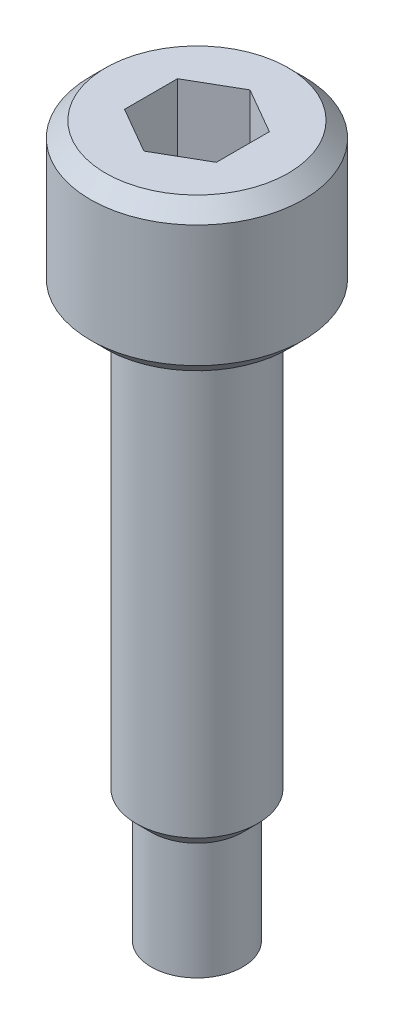
ISO-10303-21;
HEADER;
FILE_DESCRIPTION(('STEP AP214'),'2;1');
FILE_NAME('part.step','',(''),(''),'','','');
FILE_SCHEMA(('AUTOMOTIVE_DESIGN { 1 0 10303 214 1 1 1 1 }'));
ENDSEC;
DATA;
#1=APPLICATION_CONTEXT('core data for automotive mechanical design processes');
#2=APPLICATION_PROTOCOL_DEFINITION('international standard','automotive_design',2000,#1);
#3=PRODUCT_CONTEXT('',#1,'mechanical');
#4=PRODUCT('Part','Part','',(#3));
#5=PRODUCT_RELATED_PRODUCT_CATEGORY('part','',(#4));
#6=PRODUCT_DEFINITION_FORMATION('','',#4);
#7=PRODUCT_DEFINITION_CONTEXT('part definition',#1,'design');
#8=PRODUCT_DEFINITION('design','',#6,#7);
#9=PRODUCT_DEFINITION_SHAPE('','',#8);
#10=(LENGTH_UNIT() NAMED_UNIT(*) SI_UNIT(.MILLI.,.METRE.));
#11=(NAMED_UNIT(*) PLANE_ANGLE_UNIT() SI_UNIT($,.RADIAN.));
#12=(NAMED_UNIT(*) SI_UNIT($,.STERADIAN.) SOLID_ANGLE_UNIT());
#13=UNCERTAINTY_MEASURE_WITH_UNIT(LENGTH_MEASURE(1.E-05),#10,'distance_accuracy_value','');
#14=(GEOMETRIC_REPRESENTATION_CONTEXT(3) GLOBAL_UNCERTAINTY_ASSIGNED_CONTEXT((#13)) GLOBAL_UNIT_ASSIGNED_CONTEXT((#10,
#11,#12)) REPRESENTATION_CONTEXT('',''));
#15=CARTESIAN_POINT('',(0.,0.,0.));
#16=DIRECTION('',(0.,0.,1.));
#17=DIRECTION('',(1.,0.,0.));
#18=AXIS2_PLACEMENT_3D('',#15,#16,#17);
#19=CARTESIAN_POINT('',(0.,0.,0.));
#20=DIRECTION('',(0.,1.,0.));
#21=DIRECTION('',(-1.,0.,0.));
#22=AXIS2_PLACEMENT_3D('',#19,#20,#21);
#23=PLANE('',#22);
#24=CARTESIAN_POINT('',(0.,0.,0.));
#25=DIRECTION('',(0.,1.,0.));
#26=DIRECTION('',(-1.,0.,0.));
#27=AXIS2_PLACEMENT_3D('',#24,#25,#26);
#28=CIRCLE('',#27,4.50000000000001);
#29=CARTESIAN_POINT('',(-4.50000000000001,0.,0.));
#30=VERTEX_POINT('',#29);
#31=EDGE_CURVE('E160',#30,#30,#28,.T.);
#32=ORIENTED_EDGE('',*,*,#31,.F.);
#33=EDGE_LOOP('',(#32));
#34=FACE_BOUND('',#33,.T.);
#35=ADVANCED_FACE('F43',(#34),#23,.F.);
#36=CARTESIAN_POINT('',(0.,70.,0.));
#37=DIRECTION('',(0.,1.,0.));
#38=DIRECTION('',(-1.,0.,0.));
#39=AXIS2_PLACEMENT_3D('',#36,#37,#38);
#40=CYLINDRICAL_SURFACE('',#39,4.50000000000001);
#41=CARTESIAN_POINT('',(0.,11.5,0.));
#42=DIRECTION('',(0.,1.,0.));
#43=DIRECTION('',(-1.,0.,0.));
#44=AXIS2_PLACEMENT_3D('',#41,#42,#43);
#45=CIRCLE('',#44,4.50000000000001);
#46=CARTESIAN_POINT('',(-4.50000000000001,11.5,0.));
#47=VERTEX_POINT('',#46);
#48=EDGE_CURVE('E152',#47,#47,#45,.T.);
#49=ORIENTED_EDGE('',*,*,#48,.F.);
#50=EDGE_LOOP('',(#49));
#51=FACE_BOUND('',#50,.T.);
#52=ORIENTED_EDGE('',*,*,#31,.T.);
#53=EDGE_LOOP('',(#52));
#54=FACE_BOUND('',#53,.T.);
#55=ADVANCED_FACE('F204',(#51,#54),#40,.T.);
#56=CARTESIAN_POINT('',(0.,70.,0.));
#57=DIRECTION('',(0.,1.,0.));
#58=DIRECTION('',(-1.,0.,0.));
#59=AXIS2_PLACEMENT_3D('',#56,#57,#58);
#60=CYLINDRICAL_SURFACE('',#59,6.00000000000001);
#61=CARTESIAN_POINT('',(0.,13.,0.));
#62=DIRECTION('',(0.,1.,0.));
#63=DIRECTION('',(-1.,0.,0.));
#64=AXIS2_PLACEMENT_3D('',#61,#62,#63);
#65=CIRCLE('',#64,6.00000000000001);
#66=CARTESIAN_POINT('',(-6.00000000000001,13.,0.));
#67=VERTEX_POINT('',#66);
#68=EDGE_CURVE('E159',#67,#67,#65,.T.);
#69=ORIENTED_EDGE('',*,*,#68,.T.);
#70=EDGE_LOOP('',(#69));
#71=FACE_BOUND('',#70,.T.);
#72=CARTESIAN_POINT('',(0.,55.,0.));
#73=DIRECTION('',(0.,1.,0.));
#74=DIRECTION('',(-1.,0.,0.));
#75=AXIS2_PLACEMENT_3D('',#72,#73,#74);
#76=CIRCLE('',#75,6.00000000000001);
#77=CARTESIAN_POINT('',(-6.00000000000001,55.,0.));
#78=VERTEX_POINT('',#77);
#79=EDGE_CURVE('E148',#78,#78,#76,.T.);
#80=ORIENTED_EDGE('',*,*,#79,.F.);
#81=EDGE_LOOP('',(#80));
#82=FACE_BOUND('',#81,.T.);
#83=ADVANCED_FACE('F209',(#71,#82),#60,.T.);
#84=CARTESIAN_POINT('',(6.00000000000001,55.,0.));
#85=DIRECTION('',(0.,1.,0.));
#86=DIRECTION('',(-1.,0.,0.));
#87=AXIS2_PLACEMENT_3D('',#84,#85,#86);
#88=PLANE('',#87);
#89=CARTESIAN_POINT('',(0.,55.,0.));
#90=DIRECTION('',(0.,1.,0.));
#91=DIRECTION('',(-1.,0.,0.));
#92=AXIS2_PLACEMENT_3D('',#89,#90,#91);
#93=CIRCLE('',#92,9.00000000000001);
#94=CARTESIAN_POINT('',(-9.00000000000001,55.,0.));
#95=VERTEX_POINT('',#94);
#96=EDGE_CURVE('E55',#95,#95,#93,.F.);
#97=ORIENTED_EDGE('',*,*,#96,.T.);
#98=EDGE_LOOP('',(#97));
#99=FACE_BOUND('',#98,.T.);
#100=ORIENTED_EDGE('',*,*,#79,.T.);
#101=EDGE_LOOP('',(#100));
#102=FACE_BOUND('',#101,.T.);
#103=ADVANCED_FACE('F172',(#99,#102),#88,.F.);
#104=CARTESIAN_POINT('',(0.,70.,0.));
#105=DIRECTION('',(0.,1.,0.));
#106=DIRECTION('',(-1.,0.,0.));
#107=AXIS2_PLACEMENT_3D('',#104,#105,#106);
#108=CYLINDRICAL_SURFACE('',#107,10.5);
#109=CARTESIAN_POINT('',(0.,56.5,0.));
#110=DIRECTION('',(0.,1.,0.));
#111=DIRECTION('',(-1.,0.,0.));
#112=AXIS2_PLACEMENT_3D('',#109,#110,#111);
#113=CIRCLE('',#112,10.5);
#114=CARTESIAN_POINT('',(-10.5,56.5,0.));
#115=VERTEX_POINT('',#114);
#116=EDGE_CURVE('E167',#115,#115,#113,.T.);
#117=ORIENTED_EDGE('',*,*,#116,.T.);
#118=EDGE_LOOP('',(#117));
#119=FACE_BOUND('',#118,.T.);
#120=CARTESIAN_POINT('',(0.,68.5,0.));
#121=DIRECTION('',(0.,-1.,0.));
#122=DIRECTION('',(1.,0.,0.));
#123=AXIS2_PLACEMENT_3D('',#120,#121,#122);
#124=CIRCLE('',#123,10.5);
#125=CARTESIAN_POINT('',(10.5,68.5,0.));
#126=VERTEX_POINT('',#125);
#127=EDGE_CURVE('E162',#126,#126,#124,.T.);
#128=ORIENTED_EDGE('',*,*,#127,.T.);
#129=EDGE_LOOP('',(#128));
#130=FACE_BOUND('',#129,.T.);
#131=ADVANCED_FACE('F179',(#119,#130),#108,.T.);
#132=CARTESIAN_POINT('',(10.5,70.,0.));
#133=DIRECTION('',(0.,-1.,0.));
#134=DIRECTION('',(1.,0.,0.));
#135=AXIS2_PLACEMENT_3D('',#132,#133,#134);
#136=PLANE('',#135);
#137=DIRECTION('',(-0.866025403784438,0.,0.500000000000001));
#138=VECTOR('',#137,1.);
#139=CARTESIAN_POINT('',(0.,70.,-5.22463140982038));
#140=LINE('',#139,#138);
#141=CARTESIAN_POINT('',(0.,70.,-5.22463140982038));
#142=VERTEX_POINT('',#141);
#143=CARTESIAN_POINT('',(-4.52466352631456,70.,-2.61231570491018));
#144=VERTEX_POINT('',#143);
#145=EDGE_CURVE('E134',#142,#144,#140,.T.);
#146=ORIENTED_EDGE('',*,*,#145,.F.);
#147=DIRECTION('',(-0.866025403784442,0.,-0.499999999999995));
#148=VECTOR('',#147,1.);
#149=CARTESIAN_POINT('',(4.52466352631452,70.,-2.61231570491024));
#150=LINE('',#149,#148);
#151=CARTESIAN_POINT('',(4.52466352631452,70.,-2.61231570491024));
#152=VERTEX_POINT('',#151);
#153=EDGE_CURVE('E56',#152,#142,#150,.T.);
#154=ORIENTED_EDGE('',*,*,#153,.F.);
#155=DIRECTION('',(0.,0.,-1.));
#156=VECTOR('',#155,1.);
#157=CARTESIAN_POINT('',(4.52466352631457,70.,2.61231570491015));
#158=LINE('',#157,#156);
#159=CARTESIAN_POINT('',(4.52466352631457,70.,2.61231570491015));
#160=VERTEX_POINT('',#159);
#161=EDGE_CURVE('E142',#160,#152,#158,.T.);
#162=ORIENTED_EDGE('',*,*,#161,.F.);
#163=DIRECTION('',(0.866025403784435,0.,-0.500000000000007));
#164=VECTOR('',#163,1.);
#165=CARTESIAN_POINT('',(0.,70.,5.22463140982038));
#166=LINE('',#165,#164);
#167=CARTESIAN_POINT('',(0.,70.,5.22463140982038));
#168=VERTEX_POINT('',#167);
#169=EDGE_CURVE('E139',#168,#160,#166,.T.);
#170=ORIENTED_EDGE('',*,*,#169,.F.);
#171=DIRECTION('',(0.866025403784441,0.,0.499999999999995));
#172=VECTOR('',#171,1.);
#173=CARTESIAN_POINT('',(-4.52466352631455,70.,2.61231570491021));
#174=LINE('',#173,#172);
#175=CARTESIAN_POINT('',(-4.52466352631455,70.,2.61231570491021));
#176=VERTEX_POINT('',#175);
#177=EDGE_CURVE('E110',#176,#168,#174,.T.);
#178=ORIENTED_EDGE('',*,*,#177,.F.);
#179=DIRECTION('',(0.,0.,1.));
#180=VECTOR('',#179,1.);
#181=CARTESIAN_POINT('',(-4.52466352631456,70.,-2.61231570491018));
#182=LINE('',#181,#180);
#183=EDGE_CURVE('E136',#144,#176,#182,.T.);
#184=ORIENTED_EDGE('',*,*,#183,.F.);
#185=EDGE_LOOP('',(#146,#154,#162,#170,#178,#184));
#186=FACE_BOUND('',#185,.T.);
#187=CARTESIAN_POINT('',(0.,70.,0.));
#188=DIRECTION('',(0.,-1.,0.));
#189=DIRECTION('',(1.,0.,0.));
#190=AXIS2_PLACEMENT_3D('',#187,#188,#189);
#191=CIRCLE('',#190,8.99999999999999);
#192=CARTESIAN_POINT('',(8.99999999999999,70.,0.));
#193=VERTEX_POINT('',#192);
#194=EDGE_CURVE('E11',#193,#193,#191,.F.);
#195=ORIENTED_EDGE('',*,*,#194,.T.);
#196=EDGE_LOOP('',(#195));
#197=FACE_BOUND('',#196,.T.);
#198=ADVANCED_FACE('F181',(#186,#197),#136,.F.);
#199=CARTESIAN_POINT('',(0.,13.,0.));
#200=DIRECTION('',(0.,1.,0.));
#201=DIRECTION('',(-1.,0.,0.));
#202=AXIS2_PLACEMENT_3D('',#199,#200,#201);
#203=CONICAL_SURFACE('',#202,6.00000000000001,0.785398163397447);
#204=ORIENTED_EDGE('',*,*,#48,.T.);
#205=EDGE_LOOP('',(#204));
#206=FACE_BOUND('',#205,.T.);
#207=ORIENTED_EDGE('',*,*,#68,.F.);
#208=EDGE_LOOP('',(#207));
#209=FACE_BOUND('',#208,.T.);
#210=ADVANCED_FACE('F180',(#206,#209),#203,.T.);
#211=CARTESIAN_POINT('',(0.,56.5,0.));
#212=DIRECTION('',(0.,1.,0.));
#213=DIRECTION('',(-1.,0.,0.));
#214=AXIS2_PLACEMENT_3D('',#211,#212,#213);
#215=CONICAL_SURFACE('',#214,10.5,0.785398163397454);
#216=ORIENTED_EDGE('',*,*,#96,.F.);
#217=EDGE_LOOP('',(#216));
#218=FACE_BOUND('',#217,.T.);
#219=ORIENTED_EDGE('',*,*,#116,.F.);
#220=EDGE_LOOP('',(#219));
#221=FACE_BOUND('',#220,.T.);
#222=ADVANCED_FACE('F171',(#218,#221),#215,.T.);
#223=CARTESIAN_POINT('',(0.,70.,0.));
#224=DIRECTION('',(0.,-1.,0.));
#225=DIRECTION('',(1.,0.,0.));
#226=AXIS2_PLACEMENT_3D('',#223,#224,#225);
#227=CONICAL_SURFACE('',#226,8.99999999999999,0.785398163397452);
#228=ORIENTED_EDGE('',*,*,#127,.F.);
#229=EDGE_LOOP('',(#228));
#230=FACE_BOUND('',#229,.T.);
#231=ORIENTED_EDGE('',*,*,#194,.F.);
#232=EDGE_LOOP('',(#231));
#233=FACE_BOUND('',#232,.T.);
#234=ADVANCED_FACE('F46',(#230,#233),#227,.T.);
#235=CARTESIAN_POINT('',(4.52466352631452,62.,-2.61231570491024));
#236=DIRECTION('',(0.499999999999995,0.,-0.866025403784441));
#237=DIRECTION('',(-0.866025403784442,0.,-0.499999999999995));
#238=AXIS2_PLACEMENT_3D('',#235,#236,#237);
#239=PLANE('',#238);
#240=ORIENTED_EDGE('',*,*,#153,.T.);
#241=DIRECTION('',(0.,1.,0.));
#242=VECTOR('',#241,1.);
#243=CARTESIAN_POINT('',(0.,62.,-5.22463140982038));
#244=LINE('',#243,#242);
#245=CARTESIAN_POINT('',(0.,62.,-5.22463140982038));
#246=VERTEX_POINT('',#245);
#247=EDGE_CURVE('E90',#246,#142,#244,.T.);
#248=ORIENTED_EDGE('',*,*,#247,.F.);
#249=DIRECTION('',(-0.866025403784442,0.,-0.499999999999995));
#250=VECTOR('',#249,1.);
#251=CARTESIAN_POINT('',(4.52466352631452,62.,-2.61231570491024));
#252=LINE('',#251,#250);
#253=CARTESIAN_POINT('',(4.52466352631452,62.,-2.61231570491024));
#254=VERTEX_POINT('',#253);
#255=EDGE_CURVE('E145',#254,#246,#252,.T.);
#256=ORIENTED_EDGE('',*,*,#255,.F.);
#257=DIRECTION('',(0.,1.,0.));
#258=VECTOR('',#257,1.);
#259=CARTESIAN_POINT('',(4.52466352631452,62.,-2.61231570491024));
#260=LINE('',#259,#258);
#261=EDGE_CURVE('E70',#254,#152,#260,.T.);
#262=ORIENTED_EDGE('',*,*,#261,.T.);
#263=EDGE_LOOP('',(#240,#248,#256,#262));
#264=FACE_BOUND('',#263,.T.);
#265=ADVANCED_FACE('F186',(#264),#239,.F.);
#266=CARTESIAN_POINT('',(4.52466352631457,62.,2.61231570491015));
#267=DIRECTION('',(1.,0.,0.));
#268=DIRECTION('',(0.,0.,-1.));
#269=AXIS2_PLACEMENT_3D('',#266,#267,#268);
#270=PLANE('',#269);
#271=ORIENTED_EDGE('',*,*,#161,.T.);
#272=ORIENTED_EDGE('',*,*,#261,.F.);
#273=DIRECTION('',(0.,0.,-1.));
#274=VECTOR('',#273,1.);
#275=CARTESIAN_POINT('',(4.52466352631457,62.,2.61231570491015));
#276=LINE('',#275,#274);
#277=CARTESIAN_POINT('',(4.52466352631457,62.,2.61231570491015));
#278=VERTEX_POINT('',#277);
#279=EDGE_CURVE('E116',#278,#254,#276,.T.);
#280=ORIENTED_EDGE('',*,*,#279,.F.);
#281=DIRECTION('',(0.,1.,0.));
#282=VECTOR('',#281,1.);
#283=CARTESIAN_POINT('',(4.52466352631457,62.,2.61231570491015));
#284=LINE('',#283,#282);
#285=EDGE_CURVE('E112',#278,#160,#284,.T.);
#286=ORIENTED_EDGE('',*,*,#285,.T.);
#287=EDGE_LOOP('',(#271,#272,#280,#286));
#288=FACE_BOUND('',#287,.T.);
#289=ADVANCED_FACE('F257',(#288),#270,.F.);
#290=CARTESIAN_POINT('',(0.,62.,5.22463140982038));
#291=DIRECTION('',(0.500000000000007,0.,0.866025403784435));
#292=DIRECTION('',(0.866025403784435,0.,-0.500000000000007));
#293=AXIS2_PLACEMENT_3D('',#290,#291,#292);
#294=PLANE('',#293);
#295=ORIENTED_EDGE('',*,*,#169,.T.);
#296=ORIENTED_EDGE('',*,*,#285,.F.);
#297=DIRECTION('',(0.866025403784435,0.,-0.500000000000007));
#298=VECTOR('',#297,1.);
#299=CARTESIAN_POINT('',(0.,62.,5.22463140982038));
#300=LINE('',#299,#298);
#301=CARTESIAN_POINT('',(0.,62.,5.22463140982038));
#302=VERTEX_POINT('',#301);
#303=EDGE_CURVE('E113',#302,#278,#300,.T.);
#304=ORIENTED_EDGE('',*,*,#303,.F.);
#305=DIRECTION('',(0.,1.,0.));
#306=VECTOR('',#305,1.);
#307=CARTESIAN_POINT('',(0.,62.,5.22463140982038));
#308=LINE('',#307,#306);
#309=EDGE_CURVE('E99',#302,#168,#308,.T.);
#310=ORIENTED_EDGE('',*,*,#309,.T.);
#311=EDGE_LOOP('',(#295,#296,#304,#310));
#312=FACE_BOUND('',#311,.T.);
#313=ADVANCED_FACE('F117',(#312),#294,.F.);
#314=CARTESIAN_POINT('',(-4.52466352631455,62.,2.61231570491021));
#315=DIRECTION('',(-0.499999999999995,0.,0.866025403784441));
#316=DIRECTION('',(0.866025403784442,0.,0.499999999999995));
#317=AXIS2_PLACEMENT_3D('',#314,#315,#316);
#318=PLANE('',#317);
#319=ORIENTED_EDGE('',*,*,#177,.T.);
#320=ORIENTED_EDGE('',*,*,#309,.F.);
#321=DIRECTION('',(0.866025403784441,0.,0.499999999999995));
#322=VECTOR('',#321,1.);
#323=CARTESIAN_POINT('',(-4.52466352631455,62.,2.61231570491021));
#324=LINE('',#323,#322);
#325=CARTESIAN_POINT('',(-4.52466352631455,62.,2.61231570491021));
#326=VERTEX_POINT('',#325);
#327=EDGE_CURVE('E102',#326,#302,#324,.T.);
#328=ORIENTED_EDGE('',*,*,#327,.F.);
#329=DIRECTION('',(0.,1.,0.));
#330=VECTOR('',#329,1.);
#331=CARTESIAN_POINT('',(-4.52466352631455,62.,2.61231570491021));
#332=LINE('',#331,#330);
#333=EDGE_CURVE('E115',#326,#176,#332,.T.);
#334=ORIENTED_EDGE('',*,*,#333,.T.);
#335=EDGE_LOOP('',(#319,#320,#328,#334));
#336=FACE_BOUND('',#335,.T.);
#337=ADVANCED_FACE('F105',(#336),#318,.F.);
#338=CARTESIAN_POINT('',(-4.52466352631456,62.,-2.61231570491018));
#339=DIRECTION('',(-1.,0.,0.));
#340=DIRECTION('',(0.,0.,1.));
#341=AXIS2_PLACEMENT_3D('',#338,#339,#340);
#342=PLANE('',#341);
#343=ORIENTED_EDGE('',*,*,#183,.T.);
#344=ORIENTED_EDGE('',*,*,#333,.F.);
#345=DIRECTION('',(0.,0.,1.));
#346=VECTOR('',#345,1.);
#347=CARTESIAN_POINT('',(-4.52466352631456,62.,-2.61231570491018));
#348=LINE('',#347,#346);
#349=CARTESIAN_POINT('',(-4.52466352631456,62.,-2.61231570491018));
#350=VERTEX_POINT('',#349);
#351=EDGE_CURVE('E124',#350,#326,#348,.T.);
#352=ORIENTED_EDGE('',*,*,#351,.F.);
#353=DIRECTION('',(0.,1.,0.));
#354=VECTOR('',#353,1.);
#355=CARTESIAN_POINT('',(-4.52466352631456,62.,-2.61231570491018));
#356=LINE('',#355,#354);
#357=EDGE_CURVE('E149',#350,#144,#356,.T.);
#358=ORIENTED_EDGE('',*,*,#357,.T.);
#359=EDGE_LOOP('',(#343,#344,#352,#358));
#360=FACE_BOUND('',#359,.T.);
#361=ADVANCED_FACE('F281',(#360),#342,.F.);
#362=CARTESIAN_POINT('',(0.,62.,-5.22463140982038));
#363=DIRECTION('',(-0.500000000000001,0.,-0.866025403784438));
#364=DIRECTION('',(-0.866025403784438,0.,0.500000000000001));
#365=AXIS2_PLACEMENT_3D('',#362,#363,#364);
#366=PLANE('',#365);
#367=ORIENTED_EDGE('',*,*,#145,.T.);
#368=ORIENTED_EDGE('',*,*,#357,.F.);
#369=DIRECTION('',(-0.866025403784438,0.,0.500000000000001));
#370=VECTOR('',#369,1.);
#371=CARTESIAN_POINT('',(0.,62.,-5.22463140982038));
#372=LINE('',#371,#370);
#373=EDGE_CURVE('E130',#246,#350,#372,.T.);
#374=ORIENTED_EDGE('',*,*,#373,.F.);
#375=ORIENTED_EDGE('',*,*,#247,.T.);
#376=EDGE_LOOP('',(#367,#368,#374,#375));
#377=FACE_BOUND('',#376,.T.);
#378=ADVANCED_FACE('F291',(#377),#366,.F.);
#379=CARTESIAN_POINT('',(0.,62.,0.));
#380=DIRECTION('',(0.,1.,0.));
#381=DIRECTION('',(0.,0.,1.));
#382=AXIS2_PLACEMENT_3D('',#379,#380,#381);
#383=PLANE('',#382);
#384=ORIENTED_EDGE('',*,*,#255,.T.);
#385=ORIENTED_EDGE('',*,*,#373,.T.);
#386=ORIENTED_EDGE('',*,*,#351,.T.);
#387=ORIENTED_EDGE('',*,*,#327,.T.);
#388=ORIENTED_EDGE('',*,*,#303,.T.);
#389=ORIENTED_EDGE('',*,*,#279,.T.);
#390=EDGE_LOOP('',(#384,#385,#386,#387,#388,#389));
#391=FACE_BOUND('',#390,.T.);
#392=ADVANCED_FACE('F125',(#391),#383,.T.);
#393=CLOSED_SHELL('',(#35,#55,#83,#103,#131,#198,#210,#222,#234,#265,#289,#313,#337,#361,#378,#392));
#394=MANIFOLD_SOLID_BREP('B2',#393);
#395=ADVANCED_BREP_SHAPE_REPRESENTATION('',(#18,#394),#14);
#396=SHAPE_DEFINITION_REPRESENTATION(#9,#395);
ENDSEC;
END-ISO-10303-21;
